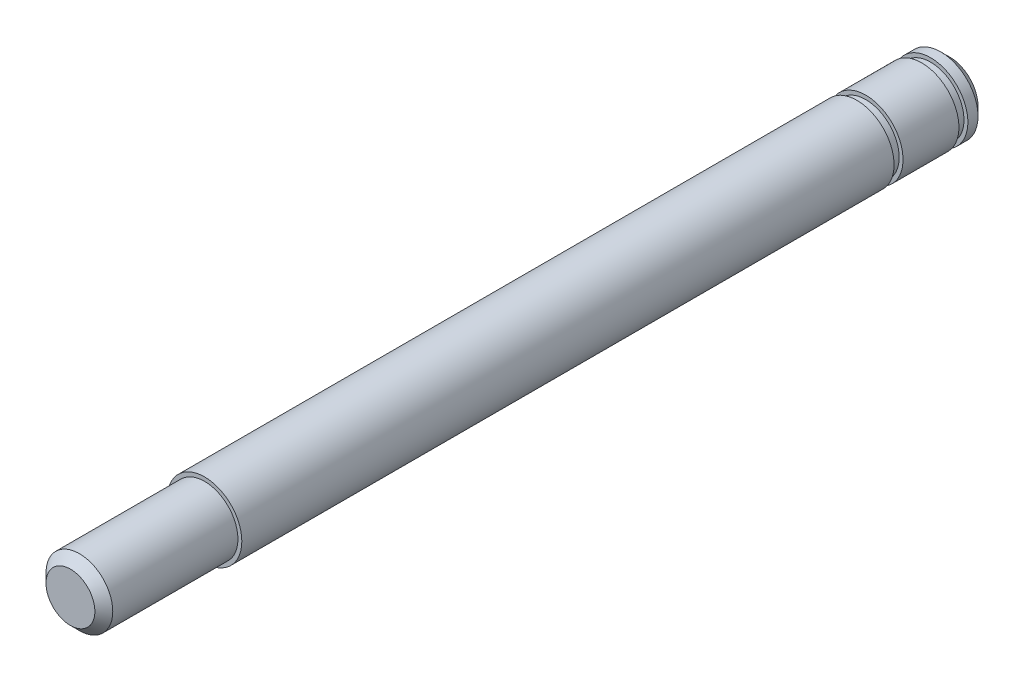
ISO-10303-21;
HEADER;
FILE_DESCRIPTION(('STEP AP214'),'2;1');
FILE_NAME('part.step','',(''),(''),'','','');
FILE_SCHEMA(('AUTOMOTIVE_DESIGN { 1 0 10303 214 1 1 1 1 }'));
ENDSEC;
DATA;
#1=APPLICATION_CONTEXT('core data for automotive mechanical design processes');
#2=APPLICATION_PROTOCOL_DEFINITION('international standard','automotive_design',2000,#1);
#3=PRODUCT_CONTEXT('',#1,'mechanical');
#4=PRODUCT('Part','Part','',(#3));
#5=PRODUCT_RELATED_PRODUCT_CATEGORY('part','',(#4));
#6=PRODUCT_DEFINITION_FORMATION('','',#4);
#7=PRODUCT_DEFINITION_CONTEXT('part definition',#1,'design');
#8=PRODUCT_DEFINITION('design','',#6,#7);
#9=PRODUCT_DEFINITION_SHAPE('','',#8);
#10=(LENGTH_UNIT() NAMED_UNIT(*) SI_UNIT(.MILLI.,.METRE.));
#11=(NAMED_UNIT(*) PLANE_ANGLE_UNIT() SI_UNIT($,.RADIAN.));
#12=(NAMED_UNIT(*) SI_UNIT($,.STERADIAN.) SOLID_ANGLE_UNIT());
#13=UNCERTAINTY_MEASURE_WITH_UNIT(LENGTH_MEASURE(1.E-05),#10,'distance_accuracy_value','');
#14=(GEOMETRIC_REPRESENTATION_CONTEXT(3) GLOBAL_UNCERTAINTY_ASSIGNED_CONTEXT((#13)) GLOBAL_UNIT_ASSIGNED_CONTEXT((#10,
#11,#12)) REPRESENTATION_CONTEXT('',''));
#15=CARTESIAN_POINT('',(0.,0.,0.));
#16=DIRECTION('',(0.,0.,1.));
#17=DIRECTION('',(1.,0.,0.));
#18=AXIS2_PLACEMENT_3D('',#15,#16,#17);
#19=CARTESIAN_POINT('',(0.,0.,15.875));
#20=DIRECTION('',(0.,0.,-1.));
#21=DIRECTION('',(-1.,0.,0.));
#22=AXIS2_PLACEMENT_3D('',#19,#20,#21);
#23=CYLINDRICAL_SURFACE('',#22,1.5875);
#24=CARTESIAN_POINT('',(0.,0.,-12.29995));
#25=DIRECTION('',(0.,0.,-1.));
#26=DIRECTION('',(-1.,0.,0.));
#27=AXIS2_PLACEMENT_3D('',#24,#25,#26);
#28=CIRCLE('',#27,1.5875);
#29=CARTESIAN_POINT('',(-1.5875,0.,-12.29995));
#30=VERTEX_POINT('',#29);
#31=EDGE_CURVE('E89',#30,#30,#28,.T.);
#32=ORIENTED_EDGE('',*,*,#31,.T.);
#33=EDGE_LOOP('',(#32));
#34=FACE_BOUND('',#33,.T.);
#35=CARTESIAN_POINT('',(0.,0.,-14.6812));
#36=DIRECTION('',(0.,0.,-1.));
#37=DIRECTION('',(-1.,0.,0.));
#38=AXIS2_PLACEMENT_3D('',#35,#36,#37);
#39=CIRCLE('',#38,1.5875);
#40=CARTESIAN_POINT('',(-1.5875,0.,-14.6812));
#41=VERTEX_POINT('',#40);
#42=EDGE_CURVE('E74',#41,#41,#39,.T.);
#43=ORIENTED_EDGE('',*,*,#42,.F.);
#44=EDGE_LOOP('',(#43));
#45=FACE_BOUND('',#44,.T.);
#46=ADVANCED_FACE('F49',(#34,#45),#23,.T.);
#47=CARTESIAN_POINT('',(0.,0.,-14.6812));
#48=DIRECTION('',(0.,0.,-1.));
#49=DIRECTION('',(-1.,0.,0.));
#50=AXIS2_PLACEMENT_3D('',#47,#48,#49);
#51=PLANE('',#50);
#52=CARTESIAN_POINT('',(0.,0.,-14.6812));
#53=DIRECTION('',(0.,0.,-1.));
#54=DIRECTION('',(-1.,0.,0.));
#55=AXIS2_PLACEMENT_3D('',#52,#53,#54);
#56=CIRCLE('',#55,1.4224);
#57=CARTESIAN_POINT('',(-1.4224,0.,-14.6812));
#58=VERTEX_POINT('',#57);
#59=EDGE_CURVE('E80',#58,#58,#56,.T.);
#60=ORIENTED_EDGE('',*,*,#59,.F.);
#61=EDGE_LOOP('',(#60));
#62=FACE_BOUND('',#61,.T.);
#63=ORIENTED_EDGE('',*,*,#42,.T.);
#64=EDGE_LOOP('',(#63));
#65=FACE_BOUND('',#64,.T.);
#66=ADVANCED_FACE('F131',(#62,#65),#51,.T.);
#67=CARTESIAN_POINT('',(0.,0.,-15.0622));
#68=DIRECTION('',(0.,0.,-1.));
#69=DIRECTION('',(-1.,0.,0.));
#70=AXIS2_PLACEMENT_3D('',#67,#68,#69);
#71=PLANE('',#70);
#72=CARTESIAN_POINT('',(0.,0.,-15.0622));
#73=DIRECTION('',(0.,0.,-1.));
#74=DIRECTION('',(-1.,0.,0.));
#75=AXIS2_PLACEMENT_3D('',#72,#73,#74);
#76=CIRCLE('',#75,1.4224);
#77=CARTESIAN_POINT('',(-1.4224,0.,-15.0622));
#78=VERTEX_POINT('',#77);
#79=EDGE_CURVE('E83',#78,#78,#76,.T.);
#80=ORIENTED_EDGE('',*,*,#79,.T.);
#81=EDGE_LOOP('',(#80));
#82=FACE_BOUND('',#81,.T.);
#83=CARTESIAN_POINT('',(0.,0.,-15.0622));
#84=DIRECTION('',(0.,0.,-1.));
#85=DIRECTION('',(-1.,0.,0.));
#86=AXIS2_PLACEMENT_3D('',#83,#84,#85);
#87=CIRCLE('',#86,1.5875);
#88=CARTESIAN_POINT('',(-1.5875,0.,-15.0622));
#89=VERTEX_POINT('',#88);
#90=EDGE_CURVE('E77',#89,#89,#87,.T.);
#91=ORIENTED_EDGE('',*,*,#90,.F.);
#92=EDGE_LOOP('',(#91));
#93=FACE_BOUND('',#92,.T.);
#94=ADVANCED_FACE('F142',(#82,#93),#71,.F.);
#95=CARTESIAN_POINT('',(0.,0.,-14.6812));
#96=DIRECTION('',(0.,0.,-1.));
#97=DIRECTION('',(-1.,0.,0.));
#98=AXIS2_PLACEMENT_3D('',#95,#96,#97);
#99=CYLINDRICAL_SURFACE('',#98,1.4224);
#100=CARTESIAN_POINT('',(-1.4224,0.,-14.6812));
#101=CARTESIAN_POINT('',(-1.4224,0.,-14.68516875));
#102=CARTESIAN_POINT('',(-1.4224,0.,-14.6891375));
#103=CARTESIAN_POINT('',(-1.4224,0.,-14.697075));
#104=CARTESIAN_POINT('',(-1.4224,0.,-14.70104375));
#105=CARTESIAN_POINT('',(-1.4224,0.,-14.70898125));
#106=CARTESIAN_POINT('',(-1.4224,0.,-14.71295));
#107=CARTESIAN_POINT('',(-1.4224,0.,-14.7208875));
#108=CARTESIAN_POINT('',(-1.4224,0.,-14.72485625));
#109=CARTESIAN_POINT('',(-1.4224,0.,-14.73279375));
#110=CARTESIAN_POINT('',(-1.4224,0.,-14.7367625));
#111=CARTESIAN_POINT('',(-1.4224,0.,-14.7447));
#112=CARTESIAN_POINT('',(-1.4224,0.,-14.74866875));
#113=CARTESIAN_POINT('',(-1.4224,0.,-14.75660625));
#114=CARTESIAN_POINT('',(-1.4224,0.,-14.760575));
#115=CARTESIAN_POINT('',(-1.4224,0.,-14.7685125));
#116=CARTESIAN_POINT('',(-1.4224,0.,-14.77248125));
#117=CARTESIAN_POINT('',(-1.4224,0.,-14.78041875));
#118=CARTESIAN_POINT('',(-1.4224,0.,-14.7843875));
#119=CARTESIAN_POINT('',(-1.4224,0.,-14.792325));
#120=CARTESIAN_POINT('',(-1.4224,0.,-14.79629375));
#121=CARTESIAN_POINT('',(-1.4224,0.,-14.80423125));
#122=CARTESIAN_POINT('',(-1.4224,0.,-14.8082));
#123=CARTESIAN_POINT('',(-1.4224,0.,-14.8161375));
#124=CARTESIAN_POINT('',(-1.4224,0.,-14.82010625));
#125=CARTESIAN_POINT('',(-1.4224,0.,-14.82804375));
#126=CARTESIAN_POINT('',(-1.4224,0.,-14.8320125));
#127=CARTESIAN_POINT('',(-1.4224,0.,-14.83995));
#128=CARTESIAN_POINT('',(-1.4224,0.,-14.84391875));
#129=CARTESIAN_POINT('',(-1.4224,0.,-14.85185625));
#130=CARTESIAN_POINT('',(-1.4224,0.,-14.855825));
#131=CARTESIAN_POINT('',(-1.4224,0.,-14.8637625));
#132=CARTESIAN_POINT('',(-1.4224,0.,-14.86773125));
#133=CARTESIAN_POINT('',(-1.4224,0.,-14.87566875));
#134=CARTESIAN_POINT('',(-1.4224,0.,-14.8796375));
#135=CARTESIAN_POINT('',(-1.4224,0.,-14.887575));
#136=CARTESIAN_POINT('',(-1.4224,0.,-14.89154375));
#137=CARTESIAN_POINT('',(-1.4224,0.,-14.89948125));
#138=CARTESIAN_POINT('',(-1.4224,0.,-14.90345));
#139=CARTESIAN_POINT('',(-1.4224,0.,-14.9113875));
#140=CARTESIAN_POINT('',(-1.4224,0.,-14.91535625));
#141=CARTESIAN_POINT('',(-1.4224,0.,-14.92329375));
#142=CARTESIAN_POINT('',(-1.4224,0.,-14.9272625));
#143=CARTESIAN_POINT('',(-1.4224,0.,-14.9352));
#144=CARTESIAN_POINT('',(-1.4224,0.,-14.93916875));
#145=CARTESIAN_POINT('',(-1.4224,0.,-14.94710625));
#146=CARTESIAN_POINT('',(-1.4224,0.,-14.951075));
#147=CARTESIAN_POINT('',(-1.4224,0.,-14.9590125));
#148=CARTESIAN_POINT('',(-1.4224,0.,-14.96298125));
#149=CARTESIAN_POINT('',(-1.4224,0.,-14.97091875));
#150=CARTESIAN_POINT('',(-1.4224,0.,-14.9748875));
#151=CARTESIAN_POINT('',(-1.4224,0.,-14.982825));
#152=CARTESIAN_POINT('',(-1.4224,0.,-14.98679375));
#153=CARTESIAN_POINT('',(-1.4224,0.,-14.99473125));
#154=CARTESIAN_POINT('',(-1.4224,0.,-14.9987));
#155=CARTESIAN_POINT('',(-1.4224,0.,-15.0066375));
#156=CARTESIAN_POINT('',(-1.4224,0.,-15.01060625));
#157=CARTESIAN_POINT('',(-1.4224,0.,-15.01854375));
#158=CARTESIAN_POINT('',(-1.4224,0.,-15.0225125));
#159=CARTESIAN_POINT('',(-1.4224,0.,-15.03045));
#160=CARTESIAN_POINT('',(-1.4224,0.,-15.03441875));
#161=CARTESIAN_POINT('',(-1.4224,0.,-15.04235625));
#162=CARTESIAN_POINT('',(-1.4224,0.,-15.046325));
#163=CARTESIAN_POINT('',(-1.4224,0.,-15.0542625));
#164=CARTESIAN_POINT('',(-1.4224,0.,-15.05823125));
#165=CARTESIAN_POINT('',(-1.4224,0.,-15.0622));
#166=B_SPLINE_CURVE_WITH_KNOTS('',3,(#100,#101,#102,#103,#104,#105,#106,#107,#108,#109,#110,
#111,#112,#113,#114,#115,#116,#117,#118,#119,#120,#121,#122,#123,#124,#125,#126,#127,#128,#129,
#130,#131,#132,#133,#134,#135,#136,#137,#138,#139,#140,#141,#142,#143,#144,#145,#146,#147,#148,
#149,#150,#151,#152,#153,#154,#155,#156,#157,#158,#159,#160,#161,#162,#163,#164,#165),
.UNSPECIFIED.,.F.,.F.,(4,2,2,2,2,2,2,2,2,2,2,2,2,2,2,2,2,2,2,2,2,2,2,2,2,2,2,2,2,2,2,2,4),(0.,
0.0119062500000006,0.0238125000000013,0.0357187500000002,0.0476250000000008,0.0595312500000014,
0.0714375000000003,0.083343750000001,0.0952500000000016,0.10715625,0.119062500000001,0.13096875,
0.142875000000001,0.154781250000001,0.1666875,0.178593750000001,0.190500000000001,0.20240625,
0.214312500000001,0.22621875,0.238125,0.250031250000001,0.2619375,0.273843750000001,
0.285750000000001,0.29765625,0.309562500000001,0.32146875,0.333375,0.345281250000001,0.3571875,
0.36909375,0.381000000000001),.UNSPECIFIED.);
#167=EDGE_CURVE('BSEAM138',#58,#78,#166,.T.);
#168=ORIENTED_EDGE('',*,*,#59,.T.);
#169=ORIENTED_EDGE('',*,*,#79,.F.);
#170=ORIENTED_EDGE('',*,*,#167,.T.);
#171=ORIENTED_EDGE('',*,*,#167,.F.);
#172=EDGE_LOOP('',(#168,#170,#169,#171));
#173=FACE_BOUND('',#172,.T.);
#174=ADVANCED_FACE('F138',(#173),#99,.T.);
#175=CARTESIAN_POINT('',(0.,0.,-15.875));
#176=DIRECTION('',(0.,0.,1.));
#177=DIRECTION('',(1.,0.,0.));
#178=AXIS2_PLACEMENT_3D('',#175,#176,#177);
#179=PLANE('',#178);
#180=CARTESIAN_POINT('',(0.,0.,-15.875));
#181=DIRECTION('',(0.,0.,1.));
#182=DIRECTION('',(1.,0.,0.));
#183=AXIS2_PLACEMENT_3D('',#180,#181,#182);
#184=CIRCLE('',#183,1.2065);
#185=CARTESIAN_POINT('',(1.20649999999999,0.,-15.875));
#186=VERTEX_POINT('',#185);
#187=EDGE_CURVE('E10',#186,#186,#184,.F.);
#188=ORIENTED_EDGE('',*,*,#187,.T.);
#189=EDGE_LOOP('',(#188));
#190=FACE_BOUND('',#189,.T.);
#191=ADVANCED_FACE('F134',(#190),#179,.F.);
#192=CARTESIAN_POINT('',(0.,0.,-15.494));
#193=DIRECTION('',(0.,0.,1.));
#194=DIRECTION('',(1.,0.,0.));
#195=AXIS2_PLACEMENT_3D('',#192,#193,#194);
#196=CIRCLE('',#195,1.5875);
#197=CARTESIAN_POINT('',(1.5875,0.,-15.494));
#198=VERTEX_POINT('',#197);
#199=EDGE_CURVE('E57',#198,#198,#196,.T.);
#200=ORIENTED_EDGE('',*,*,#199,.T.);
#201=EDGE_LOOP('',(#200));
#202=FACE_BOUND('',#201,.T.);
#203=ORIENTED_EDGE('',*,*,#90,.T.);
#204=EDGE_LOOP('',(#203));
#205=FACE_BOUND('',#204,.T.);
#206=ADVANCED_FACE('F108',(#202,#205),#23,.T.);
#207=CARTESIAN_POINT('',(0.,0.,-11.91895));
#208=DIRECTION('',(0.,0.,-1.));
#209=DIRECTION('',(-1.,0.,0.));
#210=AXIS2_PLACEMENT_3D('',#207,#208,#209);
#211=PLANE('',#210);
#212=CARTESIAN_POINT('',(0.,0.,-11.91895));
#213=DIRECTION('',(0.,0.,-1.));
#214=DIRECTION('',(-1.,0.,0.));
#215=AXIS2_PLACEMENT_3D('',#212,#213,#214);
#216=CIRCLE('',#215,1.4224);
#217=CARTESIAN_POINT('',(-1.4224,0.,-11.91895));
#218=VERTEX_POINT('',#217);
#219=EDGE_CURVE('E92',#218,#218,#216,.T.);
#220=ORIENTED_EDGE('',*,*,#219,.F.);
#221=EDGE_LOOP('',(#220));
#222=FACE_BOUND('',#221,.T.);
#223=CARTESIAN_POINT('',(0.,0.,-11.91895));
#224=DIRECTION('',(0.,0.,-1.));
#225=DIRECTION('',(-1.,0.,0.));
#226=AXIS2_PLACEMENT_3D('',#223,#224,#225);
#227=CIRCLE('',#226,1.5875);
#228=CARTESIAN_POINT('',(-1.5875,0.,-11.91895));
#229=VERTEX_POINT('',#228);
#230=EDGE_CURVE('E86',#229,#229,#227,.T.);
#231=ORIENTED_EDGE('',*,*,#230,.T.);
#232=EDGE_LOOP('',(#231));
#233=FACE_BOUND('',#232,.T.);
#234=ADVANCED_FACE('F104',(#222,#233),#211,.T.);
#235=CARTESIAN_POINT('',(0.,0.,-12.29995));
#236=DIRECTION('',(0.,0.,-1.));
#237=DIRECTION('',(-1.,0.,0.));
#238=AXIS2_PLACEMENT_3D('',#235,#236,#237);
#239=PLANE('',#238);
#240=CARTESIAN_POINT('',(0.,0.,-12.29995));
#241=DIRECTION('',(0.,0.,-1.));
#242=DIRECTION('',(-1.,0.,0.));
#243=AXIS2_PLACEMENT_3D('',#240,#241,#242);
#244=CIRCLE('',#243,1.4224);
#245=CARTESIAN_POINT('',(-1.4224,0.,-12.29995));
#246=VERTEX_POINT('',#245);
#247=EDGE_CURVE('E95',#246,#246,#244,.T.);
#248=ORIENTED_EDGE('',*,*,#247,.T.);
#249=EDGE_LOOP('',(#248));
#250=FACE_BOUND('',#249,.T.);
#251=ORIENTED_EDGE('',*,*,#31,.F.);
#252=EDGE_LOOP('',(#251));
#253=FACE_BOUND('',#252,.T.);
#254=ADVANCED_FACE('F107',(#250,#253),#239,.F.);
#255=CARTESIAN_POINT('',(0.,0.,-11.91895));
#256=DIRECTION('',(0.,0.,-1.));
#257=DIRECTION('',(-1.,0.,0.));
#258=AXIS2_PLACEMENT_3D('',#255,#256,#257);
#259=CYLINDRICAL_SURFACE('',#258,1.4224);
#260=CARTESIAN_POINT('',(-1.4224,0.,-11.91895));
#261=CARTESIAN_POINT('',(-1.4224,0.,-11.92291875));
#262=CARTESIAN_POINT('',(-1.4224,0.,-11.9268875));
#263=CARTESIAN_POINT('',(-1.4224,0.,-11.934825));
#264=CARTESIAN_POINT('',(-1.4224,0.,-11.93879375));
#265=CARTESIAN_POINT('',(-1.4224,0.,-11.94673125));
#266=CARTESIAN_POINT('',(-1.4224,0.,-11.9507));
#267=CARTESIAN_POINT('',(-1.4224,0.,-11.9586375));
#268=CARTESIAN_POINT('',(-1.4224,0.,-11.96260625));
#269=CARTESIAN_POINT('',(-1.4224,0.,-11.97054375));
#270=CARTESIAN_POINT('',(-1.4224,0.,-11.9745125));
#271=CARTESIAN_POINT('',(-1.4224,0.,-11.98245));
#272=CARTESIAN_POINT('',(-1.4224,0.,-11.98641875));
#273=CARTESIAN_POINT('',(-1.4224,0.,-11.99435625));
#274=CARTESIAN_POINT('',(-1.4224,0.,-11.998325));
#275=CARTESIAN_POINT('',(-1.4224,0.,-12.0062625));
#276=CARTESIAN_POINT('',(-1.4224,0.,-12.01023125));
#277=CARTESIAN_POINT('',(-1.4224,0.,-12.01816875));
#278=CARTESIAN_POINT('',(-1.4224,0.,-12.0221375));
#279=CARTESIAN_POINT('',(-1.4224,0.,-12.030075));
#280=CARTESIAN_POINT('',(-1.4224,0.,-12.03404375));
#281=CARTESIAN_POINT('',(-1.4224,0.,-12.04198125));
#282=CARTESIAN_POINT('',(-1.4224,0.,-12.04595));
#283=CARTESIAN_POINT('',(-1.4224,0.,-12.0538875));
#284=CARTESIAN_POINT('',(-1.4224,0.,-12.05785625));
#285=CARTESIAN_POINT('',(-1.4224,0.,-12.06579375));
#286=CARTESIAN_POINT('',(-1.4224,0.,-12.0697625));
#287=CARTESIAN_POINT('',(-1.4224,0.,-12.0777));
#288=CARTESIAN_POINT('',(-1.4224,0.,-12.08166875));
#289=CARTESIAN_POINT('',(-1.4224,0.,-12.08960625));
#290=CARTESIAN_POINT('',(-1.4224,0.,-12.093575));
#291=CARTESIAN_POINT('',(-1.4224,0.,-12.1015125));
#292=CARTESIAN_POINT('',(-1.4224,0.,-12.10548125));
#293=CARTESIAN_POINT('',(-1.4224,0.,-12.11341875));
#294=CARTESIAN_POINT('',(-1.4224,0.,-12.1173875));
#295=CARTESIAN_POINT('',(-1.4224,0.,-12.125325));
#296=CARTESIAN_POINT('',(-1.4224,0.,-12.12929375));
#297=CARTESIAN_POINT('',(-1.4224,0.,-12.13723125));
#298=CARTESIAN_POINT('',(-1.4224,0.,-12.1412));
#299=CARTESIAN_POINT('',(-1.4224,0.,-12.1491375));
#300=CARTESIAN_POINT('',(-1.4224,0.,-12.15310625));
#301=CARTESIAN_POINT('',(-1.4224,0.,-12.16104375));
#302=CARTESIAN_POINT('',(-1.4224,0.,-12.1650125));
#303=CARTESIAN_POINT('',(-1.4224,0.,-12.17295));
#304=CARTESIAN_POINT('',(-1.4224,0.,-12.17691875));
#305=CARTESIAN_POINT('',(-1.4224,0.,-12.18485625));
#306=CARTESIAN_POINT('',(-1.4224,0.,-12.188825));
#307=CARTESIAN_POINT('',(-1.4224,0.,-12.1967625));
#308=CARTESIAN_POINT('',(-1.4224,0.,-12.20073125));
#309=CARTESIAN_POINT('',(-1.4224,0.,-12.20866875));
#310=CARTESIAN_POINT('',(-1.4224,0.,-12.2126375));
#311=CARTESIAN_POINT('',(-1.4224,0.,-12.220575));
#312=CARTESIAN_POINT('',(-1.4224,0.,-12.22454375));
#313=CARTESIAN_POINT('',(-1.4224,0.,-12.23248125));
#314=CARTESIAN_POINT('',(-1.4224,0.,-12.23645));
#315=CARTESIAN_POINT('',(-1.4224,0.,-12.2443875));
#316=CARTESIAN_POINT('',(-1.4224,0.,-12.24835625));
#317=CARTESIAN_POINT('',(-1.4224,0.,-12.25629375));
#318=CARTESIAN_POINT('',(-1.4224,0.,-12.2602625));
#319=CARTESIAN_POINT('',(-1.4224,0.,-12.2682));
#320=CARTESIAN_POINT('',(-1.4224,0.,-12.27216875));
#321=CARTESIAN_POINT('',(-1.4224,0.,-12.28010625));
#322=CARTESIAN_POINT('',(-1.4224,0.,-12.284075));
#323=CARTESIAN_POINT('',(-1.4224,0.,-12.2920125));
#324=CARTESIAN_POINT('',(-1.4224,0.,-12.29598125));
#325=CARTESIAN_POINT('',(-1.4224,0.,-12.29995));
#326=B_SPLINE_CURVE_WITH_KNOTS('',3,(#260,#261,#262,#263,#264,#265,#266,#267,#268,#269,#270,
#271,#272,#273,#274,#275,#276,#277,#278,#279,#280,#281,#282,#283,#284,#285,#286,#287,#288,#289,
#290,#291,#292,#293,#294,#295,#296,#297,#298,#299,#300,#301,#302,#303,#304,#305,#306,#307,#308,
#309,#310,#311,#312,#313,#314,#315,#316,#317,#318,#319,#320,#321,#322,#323,#324,#325),
.UNSPECIFIED.,.F.,.F.,(4,2,2,2,2,2,2,2,2,2,2,2,2,2,2,2,2,2,2,2,2,2,2,2,2,2,2,2,2,2,2,2,4),(0.,
0.0119062500000006,0.0238125000000013,0.0357187500000002,0.0476250000000008,0.0595312500000014,
0.0714375000000003,0.083343750000001,0.0952499999999998,0.10715625,0.119062500000001,0.13096875,
0.142875000000001,0.154781250000001,0.1666875,0.178593750000001,0.1905,0.20240625,
0.214312500000001,0.22621875,0.238125,0.250031250000001,0.2619375,0.273843750000001,0.28575,
0.29765625,0.309562500000001,0.32146875,0.333375,0.345281250000001,0.3571875,0.36909375,
0.380999999999999),.UNSPECIFIED.);
#327=EDGE_CURVE('BSEAM101',#218,#246,#326,.T.);
#328=ORIENTED_EDGE('',*,*,#219,.T.);
#329=ORIENTED_EDGE('',*,*,#247,.F.);
#330=ORIENTED_EDGE('',*,*,#327,.T.);
#331=ORIENTED_EDGE('',*,*,#327,.F.);
#332=EDGE_LOOP('',(#328,#330,#329,#331));
#333=FACE_BOUND('',#332,.T.);
#334=ADVANCED_FACE('F101',(#333),#259,.T.);
#335=CARTESIAN_POINT('',(0.,0.,21.59));
#336=DIRECTION('',(0.,0.,1.));
#337=DIRECTION('',(1.,0.,0.));
#338=AXIS2_PLACEMENT_3D('',#335,#336,#337);
#339=PLANE('',#338);
#340=CARTESIAN_POINT('',(0.,0.,21.59));
#341=DIRECTION('',(0.,0.,1.));
#342=DIRECTION('',(1.,0.,0.));
#343=AXIS2_PLACEMENT_3D('',#340,#341,#342);
#344=CIRCLE('',#343,1.0414);
#345=CARTESIAN_POINT('',(1.0414,0.,21.59));
#346=VERTEX_POINT('',#345);
#347=EDGE_CURVE('E65',#346,#346,#344,.T.);
#348=ORIENTED_EDGE('',*,*,#347,.T.);
#349=EDGE_LOOP('',(#348));
#350=FACE_BOUND('',#349,.T.);
#351=ADVANCED_FACE('F155',(#350),#339,.T.);
#352=CARTESIAN_POINT('',(0.,0.,21.59));
#353=DIRECTION('',(0.,0.,-1.));
#354=DIRECTION('',(-1.,0.,0.));
#355=AXIS2_PLACEMENT_3D('',#352,#353,#354);
#356=CYLINDRICAL_SURFACE('',#355,1.4224);
#357=CARTESIAN_POINT('',(0.,0.,21.209));
#358=DIRECTION('',(0.,0.,1.));
#359=DIRECTION('',(1.,0.,0.));
#360=AXIS2_PLACEMENT_3D('',#357,#358,#359);
#361=CIRCLE('',#360,1.4224);
#362=CARTESIAN_POINT('',(1.4224,0.,21.209));
#363=VERTEX_POINT('',#362);
#364=EDGE_CURVE('E61',#363,#363,#361,.F.);
#365=ORIENTED_EDGE('',*,*,#364,.T.);
#366=EDGE_LOOP('',(#365));
#367=FACE_BOUND('',#366,.T.);
#368=CARTESIAN_POINT('',(0.,0.,15.875));
#369=DIRECTION('',(0.,0.,1.));
#370=DIRECTION('',(1.,0.,0.));
#371=AXIS2_PLACEMENT_3D('',#368,#369,#370);
#372=CIRCLE('',#371,1.4224);
#373=CARTESIAN_POINT('',(1.4224,0.,15.875));
#374=VERTEX_POINT('',#373);
#375=EDGE_CURVE('E70',#374,#374,#372,.T.);
#376=ORIENTED_EDGE('',*,*,#375,.T.);
#377=EDGE_LOOP('',(#376));
#378=FACE_BOUND('',#377,.T.);
#379=ADVANCED_FACE('F125',(#367,#378),#356,.T.);
#380=CARTESIAN_POINT('',(0.,0.,15.875));
#381=DIRECTION('',(0.,0.,1.));
#382=DIRECTION('',(1.,0.,0.));
#383=AXIS2_PLACEMENT_3D('',#380,#381,#382);
#384=PLANE('',#383);
#385=ORIENTED_EDGE('',*,*,#375,.F.);
#386=EDGE_LOOP('',(#385));
#387=FACE_BOUND('',#386,.T.);
#388=CARTESIAN_POINT('',(0.,0.,15.875));
#389=DIRECTION('',(0.,0.,1.));
#390=DIRECTION('',(1.,0.,0.));
#391=AXIS2_PLACEMENT_3D('',#388,#389,#390);
#392=CIRCLE('',#391,1.5875);
#393=CARTESIAN_POINT('',(1.5875,0.,15.875));
#394=VERTEX_POINT('',#393);
#395=EDGE_CURVE('E71',#394,#394,#392,.T.);
#396=ORIENTED_EDGE('',*,*,#395,.T.);
#397=EDGE_LOOP('',(#396));
#398=FACE_BOUND('',#397,.T.);
#399=ADVANCED_FACE('F115',(#387,#398),#384,.T.);
#400=ORIENTED_EDGE('',*,*,#395,.F.);
#401=EDGE_LOOP('',(#400));
#402=FACE_BOUND('',#401,.T.);
#403=ORIENTED_EDGE('',*,*,#230,.F.);
#404=EDGE_LOOP('',(#403));
#405=FACE_BOUND('',#404,.T.);
#406=ADVANCED_FACE('F112',(#402,#405),#23,.T.);
#407=CARTESIAN_POINT('',(0.,0.,21.59));
#408=DIRECTION('',(0.,0.,-1.));
#409=DIRECTION('',(-1.,0.,0.));
#410=AXIS2_PLACEMENT_3D('',#407,#408,#409);
#411=CONICAL_SURFACE('',#410,1.0414,0.785398163397447);
#412=ORIENTED_EDGE('',*,*,#364,.F.);
#413=EDGE_LOOP('',(#412));
#414=FACE_BOUND('',#413,.T.);
#415=ORIENTED_EDGE('',*,*,#347,.F.);
#416=EDGE_LOOP('',(#415));
#417=FACE_BOUND('',#416,.T.);
#418=ADVANCED_FACE('F114',(#414,#417),#411,.T.);
#419=CARTESIAN_POINT('',(0.,0.,-15.494));
#420=DIRECTION('',(0.,0.,1.));
#421=DIRECTION('',(1.,0.,0.));
#422=AXIS2_PLACEMENT_3D('',#419,#420,#421);
#423=CONICAL_SURFACE('',#422,1.5875,0.785398163397446);
#424=CARTESIAN_POINT('',(1.20649999999999,0.,-15.875));
#425=CARTESIAN_POINT('',(1.21046874999999,0.,-15.87103125));
#426=CARTESIAN_POINT('',(1.21443749999999,0.,-15.8670625));
#427=CARTESIAN_POINT('',(1.22237499999999,0.,-15.859125));
#428=CARTESIAN_POINT('',(1.22634374999999,0.,-15.85515625));
#429=CARTESIAN_POINT('',(1.23428124999999,0.,-15.84721875));
#430=CARTESIAN_POINT('',(1.23824999999999,0.,-15.84325));
#431=CARTESIAN_POINT('',(1.24618749999999,0.,-15.8353125));
#432=CARTESIAN_POINT('',(1.25015624999999,0.,-15.83134375));
#433=CARTESIAN_POINT('',(1.25809374999999,0.,-15.82340625));
#434=CARTESIAN_POINT('',(1.2620625,0.,-15.8194375));
#435=CARTESIAN_POINT('',(1.26999999999999,0.,-15.8115));
#436=CARTESIAN_POINT('',(1.27396874999999,0.,-15.80753125));
#437=CARTESIAN_POINT('',(1.28190624999999,0.,-15.79959375));
#438=CARTESIAN_POINT('',(1.285875,0.,-15.795625));
#439=CARTESIAN_POINT('',(1.2938125,0.,-15.7876875));
#440=CARTESIAN_POINT('',(1.29778125,0.,-15.78371875));
#441=CARTESIAN_POINT('',(1.30571874999999,0.,-15.77578125));
#442=CARTESIAN_POINT('',(1.3096875,0.,-15.7718125));
#443=CARTESIAN_POINT('',(1.317625,0.,-15.763875));
#444=CARTESIAN_POINT('',(1.32159375,0.,-15.75990625));
#445=CARTESIAN_POINT('',(1.32953125,0.,-15.75196875));
#446=CARTESIAN_POINT('',(1.3335,0.,-15.748));
#447=CARTESIAN_POINT('',(1.3414375,0.,-15.7400625));
#448=CARTESIAN_POINT('',(1.34540625,0.,-15.73609375));
#449=CARTESIAN_POINT('',(1.35334375,0.,-15.72815625));
#450=CARTESIAN_POINT('',(1.3573125,0.,-15.7241875));
#451=CARTESIAN_POINT('',(1.36525,0.,-15.71625));
#452=CARTESIAN_POINT('',(1.36921875,0.,-15.71228125));
#453=CARTESIAN_POINT('',(1.37715625,0.,-15.70434375));
#454=CARTESIAN_POINT('',(1.381125,0.,-15.700375));
#455=CARTESIAN_POINT('',(1.3890625,0.,-15.6924375));
#456=CARTESIAN_POINT('',(1.39303125,0.,-15.68846875));
#457=CARTESIAN_POINT('',(1.40096875,0.,-15.68053125));
#458=CARTESIAN_POINT('',(1.4049375,0.,-15.6765625));
#459=CARTESIAN_POINT('',(1.412875,0.,-15.668625));
#460=CARTESIAN_POINT('',(1.41684375,0.,-15.66465625));
#461=CARTESIAN_POINT('',(1.42478125,0.,-15.65671875));
#462=CARTESIAN_POINT('',(1.42875,0.,-15.65275));
#463=CARTESIAN_POINT('',(1.4366875,0.,-15.6448125));
#464=CARTESIAN_POINT('',(1.44065625,0.,-15.64084375));
#465=CARTESIAN_POINT('',(1.44859375,0.,-15.63290625));
#466=CARTESIAN_POINT('',(1.4525625,0.,-15.6289375));
#467=CARTESIAN_POINT('',(1.4605,0.,-15.621));
#468=CARTESIAN_POINT('',(1.46446875,0.,-15.61703125));
#469=CARTESIAN_POINT('',(1.47240625,0.,-15.60909375));
#470=CARTESIAN_POINT('',(1.476375,0.,-15.605125));
#471=CARTESIAN_POINT('',(1.4843125,0.,-15.5971875));
#472=CARTESIAN_POINT('',(1.48828125,0.,-15.59321875));
#473=CARTESIAN_POINT('',(1.49621875,0.,-15.58528125));
#474=CARTESIAN_POINT('',(1.5001875,0.,-15.5813125));
#475=CARTESIAN_POINT('',(1.508125,0.,-15.573375));
#476=CARTESIAN_POINT('',(1.51209375,0.,-15.56940625));
#477=CARTESIAN_POINT('',(1.52003125,0.,-15.56146875));
#478=CARTESIAN_POINT('',(1.524,0.,-15.5575));
#479=CARTESIAN_POINT('',(1.5319375,0.,-15.5495625));
#480=CARTESIAN_POINT('',(1.53590625,0.,-15.54559375));
#481=CARTESIAN_POINT('',(1.54384375,0.,-15.53765625));
#482=CARTESIAN_POINT('',(1.5478125,0.,-15.5336875));
#483=CARTESIAN_POINT('',(1.55575,0.,-15.52575));
#484=CARTESIAN_POINT('',(1.55971875,0.,-15.52178125));
#485=CARTESIAN_POINT('',(1.56765625,0.,-15.51384375));
#486=CARTESIAN_POINT('',(1.571625,0.,-15.509875));
#487=CARTESIAN_POINT('',(1.5795625,0.,-15.5019375));
#488=CARTESIAN_POINT('',(1.58353125,0.,-15.49796875));
#489=CARTESIAN_POINT('',(1.5875,0.,-15.494));
#490=B_SPLINE_CURVE_WITH_KNOTS('',3,(#424,#425,#426,#427,#428,#429,#430,#431,#432,#433,#434,
#435,#436,#437,#438,#439,#440,#441,#442,#443,#444,#445,#446,#447,#448,#449,#450,#451,#452,#453,
#454,#455,#456,#457,#458,#459,#460,#461,#462,#463,#464,#465,#466,#467,#468,#469,#470,#471,#472,
#473,#474,#475,#476,#477,#478,#479,#480,#481,#482,#483,#484,#485,#486,#487,#488,#489),
.UNSPECIFIED.,.F.,.F.,(4,2,2,2,2,2,2,2,2,2,2,2,2,2,2,2,2,2,2,2,2,2,2,2,2,2,2,2,2,2,2,2,4),(0.,
0.0168379802270065,0.0336759604540103,0.0505139406810168,0.0673519209080208,0.0841899011350248,
0.101027881362031,0.117865861589035,0.134703841816042,0.151541822043046,0.16837980227005,
0.185217782497056,0.20205576272406,0.218893742951064,0.235731723178071,0.252569703405075,
0.269407683632081,0.286245663859085,0.303083644086089,0.319921624313095,0.336759604540099,
0.353597584767105,0.37043556499411,0.387273545221115,0.404111525448119,0.420949505675124,
0.43778748590213,0.454625466129135,0.471463446356139,0.488301426583144,0.505139406810149,
0.521977387037154,0.53881536726416),.UNSPECIFIED.);
#491=EDGE_CURVE('BSEAM52',#186,#198,#490,.T.);
#492=ORIENTED_EDGE('',*,*,#187,.F.);
#493=ORIENTED_EDGE('',*,*,#199,.F.);
#494=ORIENTED_EDGE('',*,*,#491,.T.);
#495=ORIENTED_EDGE('',*,*,#491,.F.);
#496=EDGE_LOOP('',(#492,#494,#493,#495));
#497=FACE_BOUND('',#496,.T.);
#498=ADVANCED_FACE('F52',(#497),#423,.T.);
#499=CLOSED_SHELL('',(#46,#66,#94,#174,#191,#206,#234,#254,#334,#351,#379,#399,#406,#418,#498));
#500=MANIFOLD_SOLID_BREP('B2',#499);
#501=ADVANCED_BREP_SHAPE_REPRESENTATION('',(#18,#500),#14);
#502=SHAPE_DEFINITION_REPRESENTATION(#9,#501);
ENDSEC;
END-ISO-10303-21;
